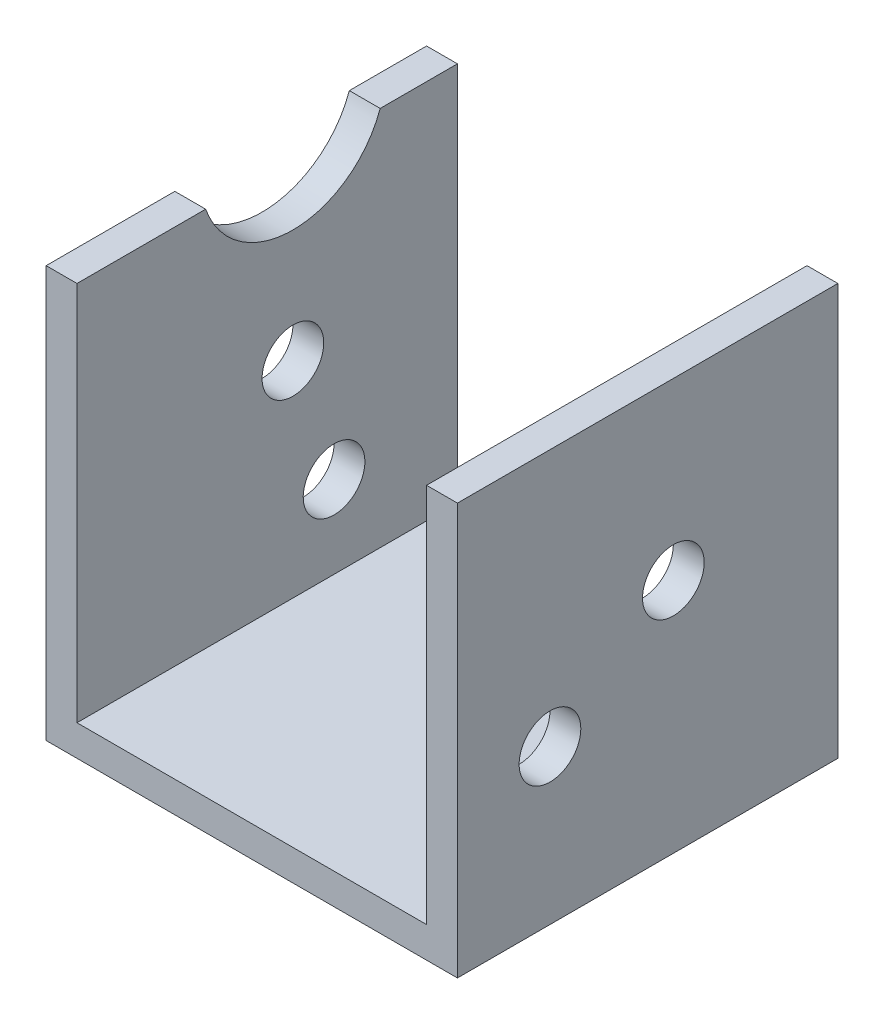
ISO-10303-21;
HEADER;
FILE_DESCRIPTION(('STEP AP214'),'2;1');
FILE_NAME('part.step','',(''),(''),'','','');
FILE_SCHEMA(('AUTOMOTIVE_DESIGN { 1 0 10303 214 1 1 1 1 }'));
ENDSEC;
DATA;
#1=APPLICATION_CONTEXT('core data for automotive mechanical design processes');
#2=APPLICATION_PROTOCOL_DEFINITION('international standard','automotive_design',2000,#1);
#3=PRODUCT_CONTEXT('',#1,'mechanical');
#4=PRODUCT('Part','Part','',(#3));
#5=PRODUCT_RELATED_PRODUCT_CATEGORY('part','',(#4));
#6=PRODUCT_DEFINITION_FORMATION('','',#4);
#7=PRODUCT_DEFINITION_CONTEXT('part definition',#1,'design');
#8=PRODUCT_DEFINITION('design','',#6,#7);
#9=PRODUCT_DEFINITION_SHAPE('','',#8);
#10=(LENGTH_UNIT() NAMED_UNIT(*) SI_UNIT(.MILLI.,.METRE.));
#11=(NAMED_UNIT(*) PLANE_ANGLE_UNIT() SI_UNIT($,.RADIAN.));
#12=(NAMED_UNIT(*) SI_UNIT($,.STERADIAN.) SOLID_ANGLE_UNIT());
#13=UNCERTAINTY_MEASURE_WITH_UNIT(LENGTH_MEASURE(1.E-05),#10,'distance_accuracy_value','');
#14=(GEOMETRIC_REPRESENTATION_CONTEXT(3) GLOBAL_UNCERTAINTY_ASSIGNED_CONTEXT((#13)) GLOBAL_UNIT_ASSIGNED_CONTEXT((#10,
#11,#12)) REPRESENTATION_CONTEXT('',''));
#15=CARTESIAN_POINT('',(0.,0.,0.));
#16=DIRECTION('',(0.,0.,1.));
#17=DIRECTION('',(1.,0.,0.));
#18=AXIS2_PLACEMENT_3D('',#15,#16,#17);
#19=CARTESIAN_POINT('',(-15.1362653272042,18.6355789473684,18.5));
#20=DIRECTION('',(0.,-1.,0.));
#21=DIRECTION('',(0.,0.,-1.));
#22=AXIS2_PLACEMENT_3D('',#19,#20,#21);
#23=PLANE('',#22);
#24=DIRECTION('',(0.,0.,-1.));
#25=VECTOR('',#24,1.);
#26=CARTESIAN_POINT('',(-15.1362653272042,18.6355789473684,18.5));
#27=LINE('',#26,#25);
#28=CARTESIAN_POINT('',(-15.1362653272042,18.6355789473684,18.5));
#29=VERTEX_POINT('',#28);
#30=CARTESIAN_POINT('',(-15.1362653272042,18.6355789473684,12.2426406871193));
#31=VERTEX_POINT('',#30);
#32=EDGE_CURVE('E159',#29,#31,#27,.T.);
#33=ORIENTED_EDGE('',*,*,#32,.T.);
#34=DIRECTION('',(-1.,0.,0.));
#35=VECTOR('',#34,1.);
#36=CARTESIAN_POINT('',(-11.6362653272042,18.6355789473684,12.2426406871193));
#37=LINE('',#36,#35);
#38=CARTESIAN_POINT('',(-16.6362653272042,18.6355789473684,12.2426406871193));
#39=VERTEX_POINT('',#38);
#40=EDGE_CURVE('E48',#31,#39,#37,.T.);
#41=ORIENTED_EDGE('',*,*,#40,.T.);
#42=DIRECTION('',(0.,0.,-1.));
#43=VECTOR('',#42,1.);
#44=CARTESIAN_POINT('',(-16.6362653272042,18.6355789473684,18.5));
#45=LINE('',#44,#43);
#46=CARTESIAN_POINT('',(-16.6362653272042,18.6355789473684,18.5));
#47=VERTEX_POINT('',#46);
#48=EDGE_CURVE('E40',#47,#39,#45,.T.);
#49=ORIENTED_EDGE('',*,*,#48,.F.);
#50=DIRECTION('',(-1.,0.,0.));
#51=VECTOR('',#50,1.);
#52=CARTESIAN_POINT('',(-15.1362653272042,18.6355789473684,18.5));
#53=LINE('',#52,#51);
#54=EDGE_CURVE('E158',#29,#47,#53,.T.);
#55=ORIENTED_EDGE('',*,*,#54,.F.);
#56=EDGE_LOOP('',(#33,#41,#49,#55));
#57=FACE_BOUND('',#56,.T.);
#58=ADVANCED_FACE('F31',(#57),#23,.F.);
#59=CARTESIAN_POINT('',(-16.6362653272042,18.6355789473684,3.75735931288071));
#60=VERTEX_POINT('',#59);
#61=CARTESIAN_POINT('',(-16.6362653272042,18.6355789473684,0.));
#62=VERTEX_POINT('',#61);
#63=EDGE_CURVE('E173',#60,#62,#45,.T.);
#64=ORIENTED_EDGE('',*,*,#63,.F.);
#65=DIRECTION('',(-1.,0.,0.));
#66=VECTOR('',#65,1.);
#67=CARTESIAN_POINT('',(-11.6362653272042,18.6355789473684,3.75735931288071));
#68=LINE('',#67,#66);
#69=CARTESIAN_POINT('',(-15.1362653272042,18.6355789473684,3.75735931288071));
#70=VERTEX_POINT('',#69);
#71=EDGE_CURVE('E183',#60,#70,#68,.F.);
#72=ORIENTED_EDGE('',*,*,#71,.T.);
#73=CARTESIAN_POINT('',(-15.1362653272042,18.6355789473684,0.));
#74=VERTEX_POINT('',#73);
#75=EDGE_CURVE('E90',#70,#74,#27,.T.);
#76=ORIENTED_EDGE('',*,*,#75,.T.);
#77=DIRECTION('',(-1.,0.,0.));
#78=VECTOR('',#77,1.);
#79=CARTESIAN_POINT('',(-15.1362653272042,18.6355789473684,0.));
#80=LINE('',#79,#78);
#81=EDGE_CURVE('E142',#74,#62,#80,.T.);
#82=ORIENTED_EDGE('',*,*,#81,.T.);
#83=EDGE_LOOP('',(#64,#72,#76,#82));
#84=FACE_BOUND('',#83,.T.);
#85=ADVANCED_FACE('F33',(#84),#23,.F.);
#86=CARTESIAN_POINT('',(-16.6362653272042,18.6355789473684,18.5));
#87=DIRECTION('',(1.,0.,0.));
#88=DIRECTION('',(0.,1.,0.));
#89=AXIS2_PLACEMENT_3D('',#86,#87,#88);
#90=PLANE('',#89);
#91=CARTESIAN_POINT('',(-16.6362653272042,10.1355789473684,8.));
#92=DIRECTION('',(-1.,0.,0.));
#93=DIRECTION('',(0.,-1.,0.));
#94=AXIS2_PLACEMENT_3D('',#91,#92,#93);
#95=CIRCLE('',#94,1.5);
#96=CARTESIAN_POINT('',(-16.6362653272042,8.63557894736843,8.));
#97=VERTEX_POINT('',#96);
#98=EDGE_CURVE('E361',#97,#97,#95,.T.);
#99=ORIENTED_EDGE('',*,*,#98,.F.);
#100=EDGE_LOOP('',(#99));
#101=FACE_BOUND('',#100,.T.);
#102=CARTESIAN_POINT('',(-16.6362653272042,4.13557894736843,6.));
#103=DIRECTION('',(-1.,0.,0.));
#104=DIRECTION('',(0.,-1.,0.));
#105=AXIS2_PLACEMENT_3D('',#102,#103,#104);
#106=CIRCLE('',#105,1.5);
#107=CARTESIAN_POINT('',(-16.6362653272042,2.63557894736843,6.));
#108=VERTEX_POINT('',#107);
#109=EDGE_CURVE('E180',#108,#108,#106,.T.);
#110=ORIENTED_EDGE('',*,*,#109,.F.);
#111=EDGE_LOOP('',(#110));
#112=FACE_BOUND('',#111,.T.);
#113=ORIENTED_EDGE('',*,*,#48,.T.);
#114=CARTESIAN_POINT('',(-16.6362653272042,20.1355789473684,8.));
#115=DIRECTION('',(-1.,0.,0.));
#116=DIRECTION('',(0.,-1.,0.));
#117=AXIS2_PLACEMENT_3D('',#114,#115,#116);
#118=CIRCLE('',#117,4.5);
#119=EDGE_CURVE('E179',#60,#39,#118,.T.);
#120=ORIENTED_EDGE('',*,*,#119,.F.);
#121=ORIENTED_EDGE('',*,*,#63,.T.);
#122=DIRECTION('',(0.,-1.,0.));
#123=VECTOR('',#122,1.);
#124=CARTESIAN_POINT('',(-16.6362653272042,18.6355789473684,0.));
#125=LINE('',#124,#123);
#126=CARTESIAN_POINT('',(-16.6362653272042,-1.36442105263157,0.));
#127=VERTEX_POINT('',#126);
#128=EDGE_CURVE('E144',#62,#127,#125,.T.);
#129=ORIENTED_EDGE('',*,*,#128,.T.);
#130=DIRECTION('',(0.,0.,-1.));
#131=VECTOR('',#130,1.);
#132=CARTESIAN_POINT('',(-16.6362653272042,-1.36442105263157,18.5));
#133=LINE('',#132,#131);
#134=CARTESIAN_POINT('',(-16.6362653272042,-1.36442105263157,18.5));
#135=VERTEX_POINT('',#134);
#136=EDGE_CURVE('E170',#135,#127,#133,.T.);
#137=ORIENTED_EDGE('',*,*,#136,.F.);
#138=DIRECTION('',(0.,-1.,0.));
#139=VECTOR('',#138,1.);
#140=CARTESIAN_POINT('',(-16.6362653272042,18.6355789473684,18.5));
#141=LINE('',#140,#139);
#142=EDGE_CURVE('E99',#47,#135,#141,.T.);
#143=ORIENTED_EDGE('',*,*,#142,.F.);
#144=EDGE_LOOP('',(#113,#120,#121,#129,#137,#143));
#145=FACE_BOUND('',#144,.T.);
#146=ADVANCED_FACE('F222',(#101,#112,#145),#90,.F.);
#147=CARTESIAN_POINT('',(-16.6362653272042,-1.36442105263157,18.5));
#148=DIRECTION('',(0.,1.,0.));
#149=DIRECTION('',(0.,0.,1.));
#150=AXIS2_PLACEMENT_3D('',#147,#148,#149);
#151=PLANE('',#150);
#152=DIRECTION('',(1.,0.,0.));
#153=VECTOR('',#152,1.);
#154=CARTESIAN_POINT('',(-16.6362653272042,-1.36442105263157,0.));
#155=LINE('',#154,#153);
#156=CARTESIAN_POINT('',(3.36373467279582,-1.36442105263157,0.));
#157=VERTEX_POINT('',#156);
#158=EDGE_CURVE('E147',#127,#157,#155,.T.);
#159=ORIENTED_EDGE('',*,*,#158,.T.);
#160=DIRECTION('',(0.,0.,-1.));
#161=VECTOR('',#160,1.);
#162=CARTESIAN_POINT('',(3.36373467279582,-1.36442105263157,18.5));
#163=LINE('',#162,#161);
#164=CARTESIAN_POINT('',(3.36373467279582,-1.36442105263157,18.5));
#165=VERTEX_POINT('',#164);
#166=EDGE_CURVE('E167',#165,#157,#163,.T.);
#167=ORIENTED_EDGE('',*,*,#166,.F.);
#168=DIRECTION('',(1.,0.,0.));
#169=VECTOR('',#168,1.);
#170=CARTESIAN_POINT('',(-16.6362653272042,-1.36442105263157,18.5));
#171=LINE('',#170,#169);
#172=EDGE_CURVE('E200',#135,#165,#171,.T.);
#173=ORIENTED_EDGE('',*,*,#172,.F.);
#174=ORIENTED_EDGE('',*,*,#136,.T.);
#175=EDGE_LOOP('',(#159,#167,#173,#174));
#176=FACE_BOUND('',#175,.T.);
#177=ADVANCED_FACE('F226',(#176),#151,.F.);
#178=CARTESIAN_POINT('',(3.36373467279582,-1.36442105263157,18.5));
#179=DIRECTION('',(-1.,0.,0.));
#180=DIRECTION('',(0.,0.,1.));
#181=AXIS2_PLACEMENT_3D('',#178,#179,#180);
#182=PLANE('',#181);
#183=CARTESIAN_POINT('',(3.36373467279582,10.1355789473684,8.));
#184=DIRECTION('',(-1.,0.,0.));
#185=DIRECTION('',(0.,-1.,0.));
#186=AXIS2_PLACEMENT_3D('',#183,#184,#185);
#187=CIRCLE('',#186,1.5);
#188=CARTESIAN_POINT('',(3.36373467279582,8.63557894736844,8.));
#189=VERTEX_POINT('',#188);
#190=EDGE_CURVE('E356',#189,#189,#187,.T.);
#191=ORIENTED_EDGE('',*,*,#190,.T.);
#192=EDGE_LOOP('',(#191));
#193=FACE_BOUND('',#192,.T.);
#194=CARTESIAN_POINT('',(3.36373467279582,6.13557894736843,14.));
#195=DIRECTION('',(1.,0.,0.));
#196=DIRECTION('',(0.,0.,-1.));
#197=AXIS2_PLACEMENT_3D('',#194,#195,#196);
#198=CIRCLE('',#197,1.5);
#199=CARTESIAN_POINT('',(3.36373467279582,6.13557894736843,12.5));
#200=VERTEX_POINT('',#199);
#201=EDGE_CURVE('E176',#200,#200,#198,.T.);
#202=ORIENTED_EDGE('',*,*,#201,.F.);
#203=EDGE_LOOP('',(#202));
#204=FACE_BOUND('',#203,.T.);
#205=DIRECTION('',(0.,1.,0.));
#206=VECTOR('',#205,1.);
#207=CARTESIAN_POINT('',(3.36373467279582,-1.36442105263157,0.));
#208=LINE('',#207,#206);
#209=CARTESIAN_POINT('',(3.36373467279582,18.6355789473684,0.));
#210=VERTEX_POINT('',#209);
#211=EDGE_CURVE('E149',#157,#210,#208,.T.);
#212=ORIENTED_EDGE('',*,*,#211,.T.);
#213=DIRECTION('',(0.,0.,-1.));
#214=VECTOR('',#213,1.);
#215=CARTESIAN_POINT('',(3.36373467279582,18.6355789473684,18.5));
#216=LINE('',#215,#214);
#217=CARTESIAN_POINT('',(3.36373467279582,18.6355789473684,18.5));
#218=VERTEX_POINT('',#217);
#219=EDGE_CURVE('E164',#218,#210,#216,.T.);
#220=ORIENTED_EDGE('',*,*,#219,.F.);
#221=DIRECTION('',(0.,1.,0.));
#222=VECTOR('',#221,1.);
#223=CARTESIAN_POINT('',(3.36373467279582,-1.36442105263157,18.5));
#224=LINE('',#223,#222);
#225=EDGE_CURVE('E202',#165,#218,#224,.T.);
#226=ORIENTED_EDGE('',*,*,#225,.F.);
#227=ORIENTED_EDGE('',*,*,#166,.T.);
#228=EDGE_LOOP('',(#212,#220,#226,#227));
#229=FACE_BOUND('',#228,.T.);
#230=ADVANCED_FACE('F208',(#193,#204,#229),#182,.F.);
#231=CARTESIAN_POINT('',(3.36373467279582,18.6355789473684,18.5));
#232=DIRECTION('',(0.,-1.,0.));
#233=DIRECTION('',(0.,0.,-1.));
#234=AXIS2_PLACEMENT_3D('',#231,#232,#233);
#235=PLANE('',#234);
#236=DIRECTION('',(-1.,0.,0.));
#237=VECTOR('',#236,1.);
#238=CARTESIAN_POINT('',(3.36373467279582,18.6355789473684,0.));
#239=LINE('',#238,#237);
#240=CARTESIAN_POINT('',(1.86373467279582,18.6355789473684,0.));
#241=VERTEX_POINT('',#240);
#242=EDGE_CURVE('E151',#210,#241,#239,.T.);
#243=ORIENTED_EDGE('',*,*,#242,.T.);
#244=DIRECTION('',(0.,0.,-1.));
#245=VECTOR('',#244,1.);
#246=CARTESIAN_POINT('',(1.86373467279582,18.6355789473684,18.5));
#247=LINE('',#246,#245);
#248=CARTESIAN_POINT('',(1.86373467279582,18.6355789473684,18.5));
#249=VERTEX_POINT('',#248);
#250=EDGE_CURVE('E133',#249,#241,#247,.T.);
#251=ORIENTED_EDGE('',*,*,#250,.F.);
#252=DIRECTION('',(-1.,0.,0.));
#253=VECTOR('',#252,1.);
#254=CARTESIAN_POINT('',(3.36373467279582,18.6355789473684,18.5));
#255=LINE('',#254,#253);
#256=EDGE_CURVE('E121',#218,#249,#255,.T.);
#257=ORIENTED_EDGE('',*,*,#256,.F.);
#258=ORIENTED_EDGE('',*,*,#219,.T.);
#259=EDGE_LOOP('',(#243,#251,#257,#258));
#260=FACE_BOUND('',#259,.T.);
#261=ADVANCED_FACE('F212',(#260),#235,.F.);
#262=CARTESIAN_POINT('',(1.86373467279582,18.6355789473684,18.5));
#263=DIRECTION('',(1.,0.,0.));
#264=DIRECTION('',(0.,1.,0.));
#265=AXIS2_PLACEMENT_3D('',#262,#263,#264);
#266=PLANE('',#265);
#267=CARTESIAN_POINT('',(1.86373467279582,10.1355789473684,8.));
#268=DIRECTION('',(1.,0.,0.));
#269=DIRECTION('',(0.,1.,0.));
#270=AXIS2_PLACEMENT_3D('',#267,#268,#269);
#271=CIRCLE('',#270,1.5);
#272=CARTESIAN_POINT('',(1.86373467279582,8.63557894736844,8.));
#273=VERTEX_POINT('',#272);
#274=EDGE_CURVE('E186',#273,#273,#271,.T.);
#275=ORIENTED_EDGE('',*,*,#274,.T.);
#276=EDGE_LOOP('',(#275));
#277=FACE_BOUND('',#276,.T.);
#278=CARTESIAN_POINT('',(1.86373467279582,6.13557894736843,14.));
#279=DIRECTION('',(1.,0.,0.));
#280=DIRECTION('',(0.,1.,0.));
#281=AXIS2_PLACEMENT_3D('',#278,#279,#280);
#282=CIRCLE('',#281,1.5);
#283=CARTESIAN_POINT('',(1.86373467279582,7.63557894736844,14.));
#284=VERTEX_POINT('',#283);
#285=EDGE_CURVE('E145',#284,#284,#282,.T.);
#286=ORIENTED_EDGE('',*,*,#285,.T.);
#287=EDGE_LOOP('',(#286));
#288=FACE_BOUND('',#287,.T.);
#289=DIRECTION('',(0.,-1.,0.));
#290=VECTOR('',#289,1.);
#291=CARTESIAN_POINT('',(1.86373467279582,18.6355789473684,0.));
#292=LINE('',#291,#290);
#293=CARTESIAN_POINT('',(1.86373467279582,0.135578947368434,0.));
#294=VERTEX_POINT('',#293);
#295=EDGE_CURVE('E130',#241,#294,#292,.T.);
#296=ORIENTED_EDGE('',*,*,#295,.T.);
#297=DIRECTION('',(0.,0.,-1.));
#298=VECTOR('',#297,1.);
#299=CARTESIAN_POINT('',(1.86373467279582,0.135578947368434,18.5));
#300=LINE('',#299,#298);
#301=CARTESIAN_POINT('',(1.86373467279582,0.135578947368434,18.5));
#302=VERTEX_POINT('',#301);
#303=EDGE_CURVE('E127',#302,#294,#300,.T.);
#304=ORIENTED_EDGE('',*,*,#303,.F.);
#305=DIRECTION('',(0.,-1.,0.));
#306=VECTOR('',#305,1.);
#307=CARTESIAN_POINT('',(1.86373467279582,18.6355789473684,18.5));
#308=LINE('',#307,#306);
#309=EDGE_CURVE('E114',#249,#302,#308,.T.);
#310=ORIENTED_EDGE('',*,*,#309,.F.);
#311=ORIENTED_EDGE('',*,*,#250,.T.);
#312=EDGE_LOOP('',(#296,#304,#310,#311));
#313=FACE_BOUND('',#312,.T.);
#314=ADVANCED_FACE('F128',(#277,#288,#313),#266,.F.);
#315=CARTESIAN_POINT('',(1.86373467279582,0.135578947368434,18.5));
#316=DIRECTION('',(0.,-1.,0.));
#317=DIRECTION('',(1.,0.,0.));
#318=AXIS2_PLACEMENT_3D('',#315,#316,#317);
#319=PLANE('',#318);
#320=DIRECTION('',(-1.,0.,0.));
#321=VECTOR('',#320,1.);
#322=CARTESIAN_POINT('',(1.86373467279582,0.135578947368434,0.));
#323=LINE('',#322,#321);
#324=CARTESIAN_POINT('',(-15.1362653272042,0.135578947368431,0.));
#325=VERTEX_POINT('',#324);
#326=EDGE_CURVE('E154',#294,#325,#323,.T.);
#327=ORIENTED_EDGE('',*,*,#326,.T.);
#328=DIRECTION('',(0.,0.,-1.));
#329=VECTOR('',#328,1.);
#330=CARTESIAN_POINT('',(-15.1362653272042,0.135578947368431,18.5));
#331=LINE('',#330,#329);
#332=CARTESIAN_POINT('',(-15.1362653272042,0.135578947368431,18.5));
#333=VERTEX_POINT('',#332);
#334=EDGE_CURVE('E134',#333,#325,#331,.T.);
#335=ORIENTED_EDGE('',*,*,#334,.F.);
#336=DIRECTION('',(-1.,0.,0.));
#337=VECTOR('',#336,1.);
#338=CARTESIAN_POINT('',(1.86373467279582,0.135578947368434,18.5));
#339=LINE('',#338,#337);
#340=EDGE_CURVE('E118',#302,#333,#339,.T.);
#341=ORIENTED_EDGE('',*,*,#340,.F.);
#342=ORIENTED_EDGE('',*,*,#303,.T.);
#343=EDGE_LOOP('',(#327,#335,#341,#342));
#344=FACE_BOUND('',#343,.T.);
#345=ADVANCED_FACE('F136',(#344),#319,.F.);
#346=CARTESIAN_POINT('',(-15.1362653272042,0.135578947368431,18.5));
#347=DIRECTION('',(-1.,0.,0.));
#348=DIRECTION('',(0.,-1.,0.));
#349=AXIS2_PLACEMENT_3D('',#346,#347,#348);
#350=PLANE('',#349);
#351=CARTESIAN_POINT('',(-15.1362653272042,10.1355789473684,8.));
#352=DIRECTION('',(-1.,0.,0.));
#353=DIRECTION('',(0.,-1.,0.));
#354=AXIS2_PLACEMENT_3D('',#351,#352,#353);
#355=CIRCLE('',#354,1.5);
#356=CARTESIAN_POINT('',(-15.1362653272042,8.63557894736843,8.));
#357=VERTEX_POINT('',#356);
#358=EDGE_CURVE('E35',#357,#357,#355,.T.);
#359=ORIENTED_EDGE('',*,*,#358,.T.);
#360=EDGE_LOOP('',(#359));
#361=FACE_BOUND('',#360,.T.);
#362=CARTESIAN_POINT('',(-15.1362653272042,4.13557894736843,6.));
#363=DIRECTION('',(-1.,0.,0.));
#364=DIRECTION('',(0.,-1.,0.));
#365=AXIS2_PLACEMENT_3D('',#362,#363,#364);
#366=CIRCLE('',#365,1.5);
#367=CARTESIAN_POINT('',(-15.1362653272042,2.63557894736843,6.));
#368=VERTEX_POINT('',#367);
#369=EDGE_CURVE('E177',#368,#368,#366,.T.);
#370=ORIENTED_EDGE('',*,*,#369,.T.);
#371=EDGE_LOOP('',(#370));
#372=FACE_BOUND('',#371,.T.);
#373=ORIENTED_EDGE('',*,*,#75,.F.);
#374=CARTESIAN_POINT('',(-15.1362653272042,20.1355789473684,8.));
#375=DIRECTION('',(-1.,0.,0.));
#376=DIRECTION('',(0.,-1.,0.));
#377=AXIS2_PLACEMENT_3D('',#374,#375,#376);
#378=CIRCLE('',#377,4.5);
#379=EDGE_CURVE('E11',#70,#31,#378,.T.);
#380=ORIENTED_EDGE('',*,*,#379,.T.);
#381=ORIENTED_EDGE('',*,*,#32,.F.);
#382=DIRECTION('',(0.,1.,0.));
#383=VECTOR('',#382,1.);
#384=CARTESIAN_POINT('',(-15.1362653272042,0.135578947368431,18.5));
#385=LINE('',#384,#383);
#386=EDGE_CURVE('E56',#333,#29,#385,.T.);
#387=ORIENTED_EDGE('',*,*,#386,.F.);
#388=ORIENTED_EDGE('',*,*,#334,.T.);
#389=DIRECTION('',(0.,1.,0.));
#390=VECTOR('',#389,1.);
#391=CARTESIAN_POINT('',(-15.1362653272042,0.135578947368431,0.));
#392=LINE('',#391,#390);
#393=EDGE_CURVE('E156',#325,#74,#392,.T.);
#394=ORIENTED_EDGE('',*,*,#393,.T.);
#395=EDGE_LOOP('',(#373,#380,#381,#387,#388,#394));
#396=FACE_BOUND('',#395,.T.);
#397=ADVANCED_FACE('F218',(#361,#372,#396),#350,.F.);
#398=CARTESIAN_POINT('',(-16.6362653272042,18.6355789473684,18.5));
#399=DIRECTION('',(0.,0.,1.));
#400=DIRECTION('',(1.,0.,0.));
#401=AXIS2_PLACEMENT_3D('',#398,#399,#400);
#402=PLANE('',#401);
#403=ORIENTED_EDGE('',*,*,#54,.T.);
#404=ORIENTED_EDGE('',*,*,#142,.T.);
#405=ORIENTED_EDGE('',*,*,#172,.T.);
#406=ORIENTED_EDGE('',*,*,#225,.T.);
#407=ORIENTED_EDGE('',*,*,#256,.T.);
#408=ORIENTED_EDGE('',*,*,#309,.T.);
#409=ORIENTED_EDGE('',*,*,#340,.T.);
#410=ORIENTED_EDGE('',*,*,#386,.T.);
#411=EDGE_LOOP('',(#403,#404,#405,#406,#407,#408,#409,#410));
#412=FACE_BOUND('',#411,.T.);
#413=ADVANCED_FACE('F116',(#412),#402,.T.);
#414=CARTESIAN_POINT('',(-16.6362653272042,18.6355789473684,0.));
#415=DIRECTION('',(0.,0.,1.));
#416=DIRECTION('',(1.,0.,0.));
#417=AXIS2_PLACEMENT_3D('',#414,#415,#416);
#418=PLANE('',#417);
#419=ORIENTED_EDGE('',*,*,#81,.F.);
#420=ORIENTED_EDGE('',*,*,#393,.F.);
#421=ORIENTED_EDGE('',*,*,#326,.F.);
#422=ORIENTED_EDGE('',*,*,#295,.F.);
#423=ORIENTED_EDGE('',*,*,#242,.F.);
#424=ORIENTED_EDGE('',*,*,#211,.F.);
#425=ORIENTED_EDGE('',*,*,#158,.F.);
#426=ORIENTED_EDGE('',*,*,#128,.F.);
#427=EDGE_LOOP('',(#419,#420,#421,#422,#423,#424,#425,#426));
#428=FACE_BOUND('',#427,.T.);
#429=ADVANCED_FACE('F215',(#428),#418,.F.);
#430=CARTESIAN_POINT('',(-1.63626532720418,6.13557894736843,14.));
#431=DIRECTION('',(1.,0.,0.));
#432=DIRECTION('',(0.,0.,-1.));
#433=AXIS2_PLACEMENT_3D('',#430,#431,#432);
#434=CYLINDRICAL_SURFACE('',#433,1.5);
#435=ORIENTED_EDGE('',*,*,#201,.T.);
#436=EDGE_LOOP('',(#435));
#437=FACE_BOUND('',#436,.T.);
#438=ORIENTED_EDGE('',*,*,#285,.F.);
#439=EDGE_LOOP('',(#438));
#440=FACE_BOUND('',#439,.T.);
#441=ADVANCED_FACE('F236',(#437,#440),#434,.F.);
#442=CARTESIAN_POINT('',(-11.6362653272042,20.1355789473684,8.));
#443=DIRECTION('',(-1.,0.,0.));
#444=DIRECTION('',(0.,-1.,0.));
#445=AXIS2_PLACEMENT_3D('',#442,#443,#444);
#446=CYLINDRICAL_SURFACE('',#445,4.5);
#447=ORIENTED_EDGE('',*,*,#379,.F.);
#448=ORIENTED_EDGE('',*,*,#71,.F.);
#449=ORIENTED_EDGE('',*,*,#119,.T.);
#450=ORIENTED_EDGE('',*,*,#40,.F.);
#451=EDGE_LOOP('',(#447,#448,#449,#450));
#452=FACE_BOUND('',#451,.T.);
#453=ADVANCED_FACE('F232',(#452),#446,.F.);
#454=CARTESIAN_POINT('',(-11.6362653272042,4.13557894736843,6.));
#455=DIRECTION('',(-1.,0.,0.));
#456=DIRECTION('',(0.,-1.,0.));
#457=AXIS2_PLACEMENT_3D('',#454,#455,#456);
#458=CYLINDRICAL_SURFACE('',#457,1.5);
#459=ORIENTED_EDGE('',*,*,#109,.T.);
#460=EDGE_LOOP('',(#459));
#461=FACE_BOUND('',#460,.T.);
#462=ORIENTED_EDGE('',*,*,#369,.F.);
#463=EDGE_LOOP('',(#462));
#464=FACE_BOUND('',#463,.T.);
#465=ADVANCED_FACE('F235',(#461,#464),#458,.F.);
#466=CARTESIAN_POINT('',(3.36373467279582,10.1355789473684,8.));
#467=DIRECTION('',(-1.,0.,0.));
#468=DIRECTION('',(0.,-1.,0.));
#469=AXIS2_PLACEMENT_3D('',#466,#467,#468);
#470=CYLINDRICAL_SURFACE('',#469,1.5);
#471=CARTESIAN_POINT('',(-16.6362653272042,8.63557894736843,8.));
#472=CARTESIAN_POINT('',(-16.6206403272042,8.63557894736843,8.));
#473=CARTESIAN_POINT('',(-16.6050153272042,8.63557894736843,8.));
#474=CARTESIAN_POINT('',(-16.5737653272042,8.63557894736843,8.));
#475=CARTESIAN_POINT('',(-16.5581403272042,8.63557894736843,8.));
#476=CARTESIAN_POINT('',(-16.5268903272042,8.63557894736843,8.));
#477=CARTESIAN_POINT('',(-16.5112653272042,8.63557894736843,8.));
#478=CARTESIAN_POINT('',(-16.4800153272042,8.63557894736843,8.));
#479=CARTESIAN_POINT('',(-16.4643903272042,8.63557894736843,8.));
#480=CARTESIAN_POINT('',(-16.4331403272042,8.63557894736843,8.));
#481=CARTESIAN_POINT('',(-16.4175153272042,8.63557894736843,8.));
#482=CARTESIAN_POINT('',(-16.3862653272042,8.63557894736843,8.));
#483=CARTESIAN_POINT('',(-16.3706403272042,8.63557894736843,8.));
#484=CARTESIAN_POINT('',(-16.3393903272042,8.63557894736843,8.));
#485=CARTESIAN_POINT('',(-16.3237653272042,8.63557894736843,8.));
#486=CARTESIAN_POINT('',(-16.2925153272042,8.63557894736843,8.));
#487=CARTESIAN_POINT('',(-16.2768903272042,8.63557894736843,8.));
#488=CARTESIAN_POINT('',(-16.2456403272042,8.63557894736843,8.));
#489=CARTESIAN_POINT('',(-16.2300153272042,8.63557894736843,8.));
#490=CARTESIAN_POINT('',(-16.1987653272042,8.63557894736843,8.));
#491=CARTESIAN_POINT('',(-16.1831403272042,8.63557894736843,8.));
#492=CARTESIAN_POINT('',(-16.1518903272042,8.63557894736843,8.));
#493=CARTESIAN_POINT('',(-16.1362653272042,8.63557894736843,8.));
#494=CARTESIAN_POINT('',(-16.1050153272042,8.63557894736843,8.));
#495=CARTESIAN_POINT('',(-16.0893903272042,8.63557894736843,8.));
#496=CARTESIAN_POINT('',(-16.0581403272042,8.63557894736843,8.));
#497=CARTESIAN_POINT('',(-16.0425153272042,8.63557894736843,8.));
#498=CARTESIAN_POINT('',(-16.0112653272042,8.63557894736843,8.));
#499=CARTESIAN_POINT('',(-15.9956403272042,8.63557894736843,8.));
#500=CARTESIAN_POINT('',(-15.9643903272042,8.63557894736843,8.));
#501=CARTESIAN_POINT('',(-15.9487653272042,8.63557894736843,8.));
#502=CARTESIAN_POINT('',(-15.9175153272042,8.63557894736843,8.));
#503=CARTESIAN_POINT('',(-15.9018903272042,8.63557894736843,8.));
#504=CARTESIAN_POINT('',(-15.8706403272042,8.63557894736843,8.));
#505=CARTESIAN_POINT('',(-15.8550153272042,8.63557894736843,8.));
#506=CARTESIAN_POINT('',(-15.8237653272042,8.63557894736843,8.));
#507=CARTESIAN_POINT('',(-15.8081403272042,8.63557894736843,8.));
#508=CARTESIAN_POINT('',(-15.7768903272042,8.63557894736843,8.));
#509=CARTESIAN_POINT('',(-15.7612653272042,8.63557894736843,8.));
#510=CARTESIAN_POINT('',(-15.7300153272042,8.63557894736843,8.));
#511=CARTESIAN_POINT('',(-15.7143903272042,8.63557894736843,8.));
#512=CARTESIAN_POINT('',(-15.6831403272042,8.63557894736843,8.));
#513=CARTESIAN_POINT('',(-15.6675153272042,8.63557894736843,8.));
#514=CARTESIAN_POINT('',(-15.6362653272042,8.63557894736843,8.));
#515=CARTESIAN_POINT('',(-15.6206403272042,8.63557894736843,8.));
#516=CARTESIAN_POINT('',(-15.5893903272042,8.63557894736843,8.));
#517=CARTESIAN_POINT('',(-15.5737653272042,8.63557894736843,8.));
#518=CARTESIAN_POINT('',(-15.5425153272042,8.63557894736843,8.));
#519=CARTESIAN_POINT('',(-15.5268903272042,8.63557894736843,8.));
#520=CARTESIAN_POINT('',(-15.4956403272042,8.63557894736843,8.));
#521=CARTESIAN_POINT('',(-15.4800153272042,8.63557894736843,8.));
#522=CARTESIAN_POINT('',(-15.4487653272042,8.63557894736843,8.));
#523=CARTESIAN_POINT('',(-15.4331403272042,8.63557894736843,8.));
#524=CARTESIAN_POINT('',(-15.4018903272042,8.63557894736843,8.));
#525=CARTESIAN_POINT('',(-15.3862653272042,8.63557894736843,8.));
#526=CARTESIAN_POINT('',(-15.3550153272042,8.63557894736843,8.));
#527=CARTESIAN_POINT('',(-15.3393903272042,8.63557894736843,8.));
#528=CARTESIAN_POINT('',(-15.3081403272042,8.63557894736843,8.));
#529=CARTESIAN_POINT('',(-15.2925153272042,8.63557894736843,8.));
#530=CARTESIAN_POINT('',(-15.2612653272042,8.63557894736843,8.));
#531=CARTESIAN_POINT('',(-15.2456403272042,8.63557894736843,8.));
#532=CARTESIAN_POINT('',(-15.2143903272042,8.63557894736843,8.));
#533=CARTESIAN_POINT('',(-15.1987653272042,8.63557894736843,8.));
#534=CARTESIAN_POINT('',(-15.1675153272042,8.63557894736843,8.));
#535=CARTESIAN_POINT('',(-15.1518903272042,8.63557894736843,8.));
#536=CARTESIAN_POINT('',(-15.1362653272042,8.63557894736843,8.));
#537=B_SPLINE_CURVE_WITH_KNOTS('',3,(#471,#472,#473,#474,#475,#476,#477,#478,#479,#480,#481,
#482,#483,#484,#485,#486,#487,#488,#489,#490,#491,#492,#493,#494,#495,#496,#497,#498,#499,#500,
#501,#502,#503,#504,#505,#506,#507,#508,#509,#510,#511,#512,#513,#514,#515,#516,#517,#518,#519,
#520,#521,#522,#523,#524,#525,#526,#527,#528,#529,#530,#531,#532,#533,#534,#535,#536),
.UNSPECIFIED.,.F.,.F.,(4,2,2,2,2,2,2,2,2,2,2,2,2,2,2,2,2,2,2,2,2,2,2,2,2,2,2,2,2,2,2,2,4),(0.,
0.0468749999999983,0.0937500000000001,0.140624999999998,0.1875,0.234374999999998,0.28125,
0.328124999999999,0.375,0.421874999999999,0.468749999999997,0.515624999999999,0.562499999999997,
0.609374999999999,0.656249999999997,0.703124999999999,0.749999999999997,0.796874999999996,
0.843749999999997,0.890624999999996,0.937499999999997,0.984374999999996,1.03125,1.078125,
1.12499999999999,1.171875,1.21874999999999,1.265625,1.31249999999999,1.359375,1.40624999999999,
1.453125,1.49999999999999),.UNSPECIFIED.);
#538=EDGE_CURVE('BSEAM242',#97,#357,#537,.T.);
#539=ORIENTED_EDGE('',*,*,#98,.T.);
#540=ORIENTED_EDGE('',*,*,#358,.F.);
#541=ORIENTED_EDGE('',*,*,#538,.T.);
#542=ORIENTED_EDGE('',*,*,#538,.F.);
#543=EDGE_LOOP('',(#539,#541,#540,#542));
#544=FACE_BOUND('',#543,.T.);
#545=ADVANCED_FACE('F242',(#544),#470,.F.);
#546=CARTESIAN_POINT('',(3.36373467279582,8.63557894736844,8.));
#547=CARTESIAN_POINT('',(3.34810967279582,8.63557894736844,8.));
#548=CARTESIAN_POINT('',(3.33248467279582,8.63557894736844,8.));
#549=CARTESIAN_POINT('',(3.30123467279582,8.63557894736844,8.));
#550=CARTESIAN_POINT('',(3.28560967279582,8.63557894736844,8.));
#551=CARTESIAN_POINT('',(3.25435967279582,8.63557894736844,8.));
#552=CARTESIAN_POINT('',(3.23873467279582,8.63557894736844,8.));
#553=CARTESIAN_POINT('',(3.20748467279582,8.63557894736844,8.));
#554=CARTESIAN_POINT('',(3.19185967279582,8.63557894736844,8.));
#555=CARTESIAN_POINT('',(3.16060967279582,8.63557894736844,8.));
#556=CARTESIAN_POINT('',(3.14498467279582,8.63557894736844,8.));
#557=CARTESIAN_POINT('',(3.11373467279582,8.63557894736844,8.));
#558=CARTESIAN_POINT('',(3.09810967279582,8.63557894736844,8.));
#559=CARTESIAN_POINT('',(3.06685967279582,8.63557894736844,8.));
#560=CARTESIAN_POINT('',(3.05123467279582,8.63557894736844,8.));
#561=CARTESIAN_POINT('',(3.01998467279582,8.63557894736844,8.));
#562=CARTESIAN_POINT('',(3.00435967279582,8.63557894736844,8.));
#563=CARTESIAN_POINT('',(2.97310967279582,8.63557894736844,8.));
#564=CARTESIAN_POINT('',(2.95748467279582,8.63557894736844,8.));
#565=CARTESIAN_POINT('',(2.92623467279582,8.63557894736844,8.));
#566=CARTESIAN_POINT('',(2.91060967279582,8.63557894736844,8.));
#567=CARTESIAN_POINT('',(2.87935967279582,8.63557894736844,8.));
#568=CARTESIAN_POINT('',(2.86373467279582,8.63557894736844,8.));
#569=CARTESIAN_POINT('',(2.83248467279582,8.63557894736844,8.));
#570=CARTESIAN_POINT('',(2.81685967279582,8.63557894736844,8.));
#571=CARTESIAN_POINT('',(2.78560967279582,8.63557894736844,8.));
#572=CARTESIAN_POINT('',(2.76998467279582,8.63557894736844,8.));
#573=CARTESIAN_POINT('',(2.73873467279582,8.63557894736844,8.));
#574=CARTESIAN_POINT('',(2.72310967279582,8.63557894736844,8.));
#575=CARTESIAN_POINT('',(2.69185967279582,8.63557894736844,8.));
#576=CARTESIAN_POINT('',(2.67623467279582,8.63557894736844,8.));
#577=CARTESIAN_POINT('',(2.64498467279582,8.63557894736844,8.));
#578=CARTESIAN_POINT('',(2.62935967279582,8.63557894736844,8.));
#579=CARTESIAN_POINT('',(2.59810967279582,8.63557894736844,8.));
#580=CARTESIAN_POINT('',(2.58248467279582,8.63557894736844,8.));
#581=CARTESIAN_POINT('',(2.55123467279582,8.63557894736844,8.));
#582=CARTESIAN_POINT('',(2.53560967279582,8.63557894736844,8.));
#583=CARTESIAN_POINT('',(2.50435967279582,8.63557894736844,8.));
#584=CARTESIAN_POINT('',(2.48873467279582,8.63557894736844,8.));
#585=CARTESIAN_POINT('',(2.45748467279582,8.63557894736844,8.));
#586=CARTESIAN_POINT('',(2.44185967279582,8.63557894736844,8.));
#587=CARTESIAN_POINT('',(2.41060967279582,8.63557894736844,8.));
#588=CARTESIAN_POINT('',(2.39498467279582,8.63557894736844,8.));
#589=CARTESIAN_POINT('',(2.36373467279582,8.63557894736844,8.));
#590=CARTESIAN_POINT('',(2.34810967279582,8.63557894736844,8.));
#591=CARTESIAN_POINT('',(2.31685967279582,8.63557894736844,8.));
#592=CARTESIAN_POINT('',(2.30123467279582,8.63557894736844,8.));
#593=CARTESIAN_POINT('',(2.26998467279582,8.63557894736844,8.));
#594=CARTESIAN_POINT('',(2.25435967279582,8.63557894736844,8.));
#595=CARTESIAN_POINT('',(2.22310967279582,8.63557894736844,8.));
#596=CARTESIAN_POINT('',(2.20748467279582,8.63557894736844,8.));
#597=CARTESIAN_POINT('',(2.17623467279582,8.63557894736844,8.));
#598=CARTESIAN_POINT('',(2.16060967279582,8.63557894736844,8.));
#599=CARTESIAN_POINT('',(2.12935967279582,8.63557894736844,8.));
#600=CARTESIAN_POINT('',(2.11373467279582,8.63557894736844,8.));
#601=CARTESIAN_POINT('',(2.08248467279582,8.63557894736844,8.));
#602=CARTESIAN_POINT('',(2.06685967279582,8.63557894736844,8.));
#603=CARTESIAN_POINT('',(2.03560967279582,8.63557894736844,8.));
#604=CARTESIAN_POINT('',(2.01998467279582,8.63557894736844,8.));
#605=CARTESIAN_POINT('',(1.98873467279582,8.63557894736844,8.));
#606=CARTESIAN_POINT('',(1.97310967279582,8.63557894736844,8.));
#607=CARTESIAN_POINT('',(1.94185967279582,8.63557894736844,8.));
#608=CARTESIAN_POINT('',(1.92623467279582,8.63557894736844,8.));
#609=CARTESIAN_POINT('',(1.89498467279582,8.63557894736844,8.));
#610=CARTESIAN_POINT('',(1.87935967279582,8.63557894736844,8.));
#611=CARTESIAN_POINT('',(1.86373467279582,8.63557894736844,8.));
#612=B_SPLINE_CURVE_WITH_KNOTS('',3,(#546,#547,#548,#549,#550,#551,#552,#553,#554,#555,#556,
#557,#558,#559,#560,#561,#562,#563,#564,#565,#566,#567,#568,#569,#570,#571,#572,#573,#574,#575,
#576,#577,#578,#579,#580,#581,#582,#583,#584,#585,#586,#587,#588,#589,#590,#591,#592,#593,#594,
#595,#596,#597,#598,#599,#600,#601,#602,#603,#604,#605,#606,#607,#608,#609,#610,#611),
.UNSPECIFIED.,.F.,.F.,(4,2,2,2,2,2,2,2,2,2,2,2,2,2,2,2,2,2,2,2,2,2,2,2,2,2,2,2,2,2,2,2,4),(0.,
0.0468750000000005,0.0937500000000005,0.140625000000001,0.187500000000001,0.234375000000001,
0.281250000000001,0.328125000000001,0.375000000000001,0.421875000000001,0.468750000000001,
0.515625000000001,0.562500000000001,0.609375000000001,0.656250000000001,0.703125000000001,
0.750000000000002,0.796875000000002,0.843750000000002,0.890625000000002,0.937500000000002,
0.984375000000002,1.03125,1.078125,1.125,1.171875,1.21875,1.265625,1.3125,1.359375,1.40625,
1.453125,1.5),.UNSPECIFIED.);
#613=EDGE_CURVE('BSEAM340',#189,#273,#612,.T.);
#614=ORIENTED_EDGE('',*,*,#190,.F.);
#615=ORIENTED_EDGE('',*,*,#274,.F.);
#616=ORIENTED_EDGE('',*,*,#613,.T.);
#617=ORIENTED_EDGE('',*,*,#613,.F.);
#618=EDGE_LOOP('',(#614,#616,#615,#617));
#619=FACE_BOUND('',#618,.T.);
#620=ADVANCED_FACE('F340',(#619),#470,.F.);
#621=CLOSED_SHELL('',(#58,#85,#146,#177,#230,#261,#314,#345,#397,#413,#429,#441,#453,#465,#545,#620));
#622=MANIFOLD_SOLID_BREP('B2',#621);
#623=ADVANCED_BREP_SHAPE_REPRESENTATION('',(#18,#622),#14);
#624=SHAPE_DEFINITION_REPRESENTATION(#9,#623);
ENDSEC;
END-ISO-10303-21;
